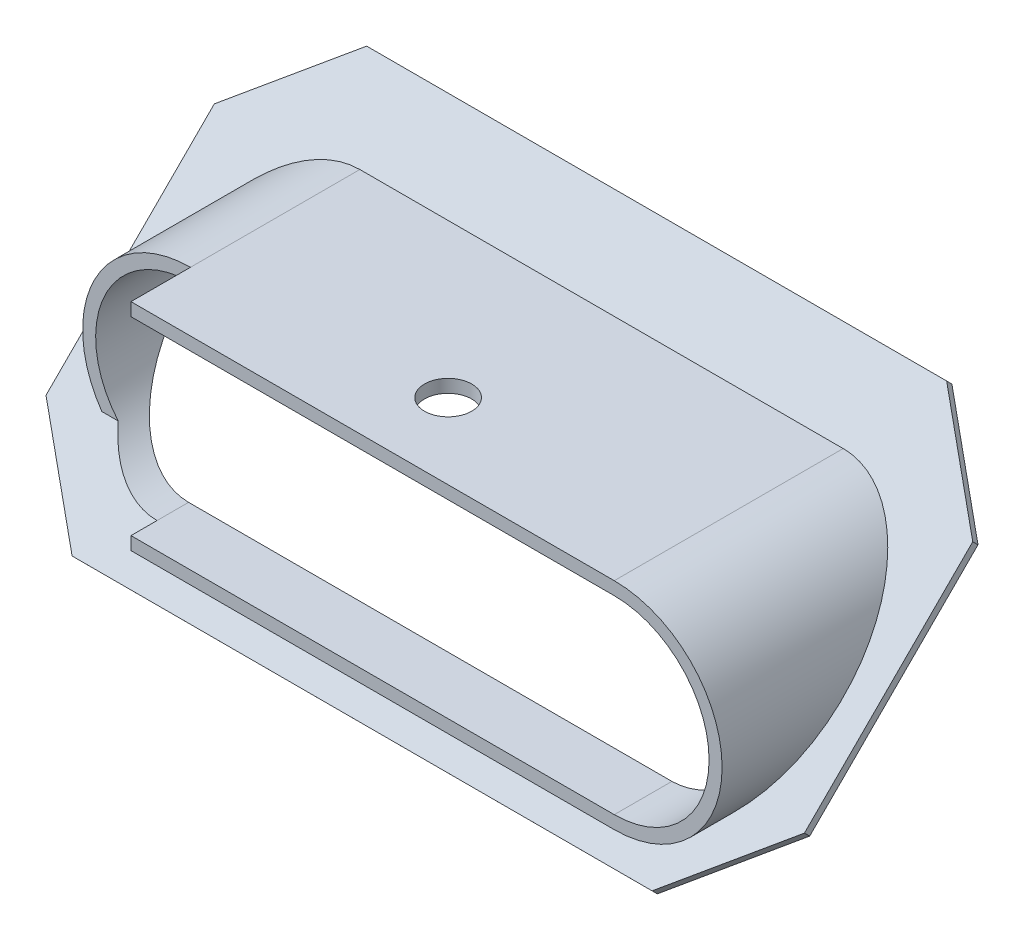
ISO-10303-21;
HEADER;
FILE_DESCRIPTION(('STEP AP214'),'2;1');
FILE_NAME('part.step','',(''),(''),'','','');
FILE_SCHEMA(('AUTOMOTIVE_DESIGN { 1 0 10303 214 1 1 1 1 }'));
ENDSEC;
DATA;
#1=APPLICATION_CONTEXT('core data for automotive mechanical design processes');
#2=APPLICATION_PROTOCOL_DEFINITION('international standard','automotive_design',2000,#1);
#3=PRODUCT_CONTEXT('',#1,'mechanical');
#4=PRODUCT('Part','Part','',(#3));
#5=PRODUCT_RELATED_PRODUCT_CATEGORY('part','',(#4));
#6=PRODUCT_DEFINITION_FORMATION('','',#4);
#7=PRODUCT_DEFINITION_CONTEXT('part definition',#1,'design');
#8=PRODUCT_DEFINITION('design','',#6,#7);
#9=PRODUCT_DEFINITION_SHAPE('','',#8);
#10=(LENGTH_UNIT() NAMED_UNIT(*) SI_UNIT(.MILLI.,.METRE.));
#11=(NAMED_UNIT(*) PLANE_ANGLE_UNIT() SI_UNIT($,.RADIAN.));
#12=(NAMED_UNIT(*) SI_UNIT($,.STERADIAN.) SOLID_ANGLE_UNIT());
#13=UNCERTAINTY_MEASURE_WITH_UNIT(LENGTH_MEASURE(1.E-05),#10,'distance_accuracy_value','');
#14=(GEOMETRIC_REPRESENTATION_CONTEXT(3) GLOBAL_UNCERTAINTY_ASSIGNED_CONTEXT((#13)) GLOBAL_UNIT_ASSIGNED_CONTEXT((#10,
#11,#12)) REPRESENTATION_CONTEXT('',''));
#15=CARTESIAN_POINT('',(0.,0.,0.));
#16=DIRECTION('',(0.,0.,1.));
#17=DIRECTION('',(1.,0.,0.));
#18=AXIS2_PLACEMENT_3D('',#15,#16,#17);
#19=CARTESIAN_POINT('',(69.7281455494334,21.9121249549721,35.0250079347562));
#20=DIRECTION('',(0.,0.,1.));
#21=DIRECTION('',(1.,0.,0.));
#22=AXIS2_PLACEMENT_3D('',#19,#20,#21);
#23=PLANE('',#22);
#24=DIRECTION('',(-1.,0.,0.));
#25=VECTOR('',#24,1.);
#26=CARTESIAN_POINT('',(0.,14.5,35.0250079347562));
#27=LINE('',#26,#25);
#28=CARTESIAN_POINT('',(32.5000000000001,14.5,35.0250079347562));
#29=VERTEX_POINT('',#28);
#30=CARTESIAN_POINT('',(-32.5000000000001,14.5,35.0250079347562));
#31=VERTEX_POINT('',#30);
#32=EDGE_CURVE('E211',#29,#31,#27,.T.);
#33=ORIENTED_EDGE('',*,*,#32,.T.);
#34=DIRECTION('',(0.,-1.,0.));
#35=VECTOR('',#34,1.);
#36=CARTESIAN_POINT('',(-32.5000000000001,21.9121249549721,35.0250079347562));
#37=LINE('',#36,#35);
#38=CARTESIAN_POINT('',(-32.5000000000001,12.75,35.0250079347562));
#39=VERTEX_POINT('',#38);
#40=EDGE_CURVE('E195',#31,#39,#37,.T.);
#41=ORIENTED_EDGE('',*,*,#40,.T.);
#42=DIRECTION('',(-1.,0.,0.));
#43=VECTOR('',#42,1.);
#44=CARTESIAN_POINT('',(-32.5000000000001,12.75,35.0250079347562));
#45=LINE('',#44,#43);
#46=CARTESIAN_POINT('',(32.5000000000001,12.75,35.0250079347562));
#47=VERTEX_POINT('',#46);
#48=EDGE_CURVE('E416',#47,#39,#45,.T.);
#49=ORIENTED_EDGE('',*,*,#48,.F.);
#50=CARTESIAN_POINT('',(32.5000000000001,0.,35.0250079347562));
#51=DIRECTION('',(0.,0.,1.));
#52=DIRECTION('',(1.,0.,0.));
#53=AXIS2_PLACEMENT_3D('',#50,#51,#52);
#54=CIRCLE('',#53,12.75);
#55=CARTESIAN_POINT('',(32.5000000000001,-12.75,35.0250079347562));
#56=VERTEX_POINT('',#55);
#57=EDGE_CURVE('E413',#47,#56,#54,.F.);
#58=ORIENTED_EDGE('',*,*,#57,.T.);
#59=DIRECTION('',(-1.,0.,0.));
#60=VECTOR('',#59,1.);
#61=CARTESIAN_POINT('',(-32.5000000000001,-12.75,35.0250079347562));
#62=LINE('',#61,#60);
#63=CARTESIAN_POINT('',(-32.5000000000001,-12.75,35.0250079347562));
#64=VERTEX_POINT('',#63);
#65=EDGE_CURVE('E208',#56,#64,#62,.T.);
#66=ORIENTED_EDGE('',*,*,#65,.T.);
#67=DIRECTION('',(0.,1.,0.));
#68=VECTOR('',#67,1.);
#69=CARTESIAN_POINT('',(-32.5000000000001,-14.5,35.0250079347562));
#70=LINE('',#69,#68);
#71=CARTESIAN_POINT('',(-32.5000000000001,-14.5,35.0250079347562));
#72=VERTEX_POINT('',#71);
#73=EDGE_CURVE('E378',#72,#64,#70,.T.);
#74=ORIENTED_EDGE('',*,*,#73,.F.);
#75=DIRECTION('',(-1.,0.,0.));
#76=VECTOR('',#75,1.);
#77=CARTESIAN_POINT('',(69.7281455494334,-14.5,35.0250079347562));
#78=LINE('',#77,#76);
#79=CARTESIAN_POINT('',(32.5000000000001,-14.5,35.0250079347562));
#80=VERTEX_POINT('',#79);
#81=EDGE_CURVE('E409',#80,#72,#78,.T.);
#82=ORIENTED_EDGE('',*,*,#81,.F.);
#83=CARTESIAN_POINT('',(32.5000000000001,0.,35.0250079347562));
#84=DIRECTION('',(0.,0.,1.));
#85=DIRECTION('',(1.,0.,0.));
#86=AXIS2_PLACEMENT_3D('',#83,#84,#85);
#87=CIRCLE('',#86,14.5);
#88=EDGE_CURVE('E213',#80,#29,#87,.T.);
#89=ORIENTED_EDGE('',*,*,#88,.T.);
#90=EDGE_LOOP('',(#33,#41,#49,#58,#66,#74,#82,#89));
#91=FACE_BOUND('',#90,.T.);
#92=ADVANCED_FACE('F41',(#91),#23,.T.);
#93=CARTESIAN_POINT('',(0.,14.5,80.0000000000001));
#94=DIRECTION('',(0.,-1.,0.));
#95=DIRECTION('',(0.,0.,-1.));
#96=AXIS2_PLACEMENT_3D('',#93,#94,#95);
#97=PLANE('',#96);
#98=CARTESIAN_POINT('',(2.62925291935353E-05,14.5,24.8750079347541));
#99=DIRECTION('',(0.,1.,0.));
#100=DIRECTION('',(0.,0.,1.));
#101=AXIS2_PLACEMENT_3D('',#98,#99,#100);
#102=CIRCLE('',#101,3.17499999999999);
#103=CARTESIAN_POINT('',(2.62925291935353E-05,14.5,28.0500079347541));
#104=VERTEX_POINT('',#103);
#105=EDGE_CURVE('E365',#104,#104,#102,.T.);
#106=ORIENTED_EDGE('',*,*,#105,.F.);
#107=EDGE_LOOP('',(#106));
#108=FACE_BOUND('',#107,.T.);
#109=ORIENTED_EDGE('',*,*,#32,.F.);
#110=DIRECTION('',(0.,0.,-1.));
#111=VECTOR('',#110,1.);
#112=CARTESIAN_POINT('',(32.5000000000001,14.5,80.0000000000001));
#113=LINE('',#112,#111);
#114=CARTESIAN_POINT('',(32.5000000000001,14.5,4.24460595078653));
#115=VERTEX_POINT('',#114);
#116=EDGE_CURVE('E463',#29,#115,#113,.T.);
#117=ORIENTED_EDGE('',*,*,#116,.T.);
#118=DIRECTION('',(-1.,0.,0.));
#119=VECTOR('',#118,1.);
#120=CARTESIAN_POINT('',(0.,14.5,4.24460595078653));
#121=LINE('',#120,#119);
#122=CARTESIAN_POINT('',(-32.5000000000001,14.5,4.24460595078652));
#123=VERTEX_POINT('',#122);
#124=EDGE_CURVE('E460',#115,#123,#121,.T.);
#125=ORIENTED_EDGE('',*,*,#124,.T.);
#126=DIRECTION('',(0.,0.,-1.));
#127=VECTOR('',#126,1.);
#128=CARTESIAN_POINT('',(-32.5000000000001,14.5,80.0000000000001));
#129=LINE('',#128,#127);
#130=CARTESIAN_POINT('',(-32.5000000000001,14.5,27.0250079347562));
#131=VERTEX_POINT('',#130);
#132=EDGE_CURVE('E222',#131,#123,#129,.T.);
#133=ORIENTED_EDGE('',*,*,#132,.F.);
#134=EDGE_CURVE('E200',#31,#131,#129,.T.);
#135=ORIENTED_EDGE('',*,*,#134,.F.);
#136=EDGE_LOOP('',(#109,#117,#125,#133,#135));
#137=FACE_BOUND('',#136,.T.);
#138=ADVANCED_FACE('F220',(#108,#137),#97,.F.);
#139=CARTESIAN_POINT('',(-32.5000000000001,0.,80.0000000000001));
#140=DIRECTION('',(0.,0.,-1.));
#141=DIRECTION('',(-1.,0.,0.));
#142=AXIS2_PLACEMENT_3D('',#139,#140,#141);
#143=CYLINDRICAL_SURFACE('',#142,14.5);
#144=CARTESIAN_POINT('',(-32.5000000000001,0.,18.7580361379704));
#145=DIRECTION('',(0.,0.707434021964028,0.706779388895714));
#146=DIRECTION('',(0.,0.706779388895714,-0.707434021964028));
#147=AXIS2_PLACEMENT_3D('',#144,#145,#146);
#148=ELLIPSE('',#147,20.5155954288015,14.5);
#149=CARTESIAN_POINT('',(-44.4177851377498,-8.25932184930662,27.0250079347562));
#150=VERTEX_POINT('',#149);
#151=EDGE_CURVE('E456',#123,#150,#148,.T.);
#152=ORIENTED_EDGE('',*,*,#151,.T.);
#153=CARTESIAN_POINT('',(-32.5000000000001,0.,27.0250079347562));
#154=DIRECTION('',(0.,0.,-1.));
#155=DIRECTION('',(-1.,0.,0.));
#156=AXIS2_PLACEMENT_3D('',#153,#154,#155);
#157=CIRCLE('',#156,14.5);
#158=EDGE_CURVE('E402',#150,#131,#157,.T.);
#159=ORIENTED_EDGE('',*,*,#158,.T.);
#160=ORIENTED_EDGE('',*,*,#132,.T.);
#161=EDGE_LOOP('',(#152,#159,#160));
#162=FACE_BOUND('',#161,.T.);
#163=ADVANCED_FACE('F494',(#162),#143,.T.);
#164=CARTESIAN_POINT('',(0.,-14.5,80.0000000000001));
#165=DIRECTION('',(0.,-1.,0.));
#166=DIRECTION('',(0.,0.,-1.));
#167=AXIS2_PLACEMENT_3D('',#164,#165,#166);
#168=PLANE('',#167);
#169=DIRECTION('',(0.,0.,-1.));
#170=VECTOR('',#169,1.);
#171=CARTESIAN_POINT('',(32.5000000000001,-14.5,80.0000000000001));
#172=LINE('',#171,#170);
#173=CARTESIAN_POINT('',(32.5000000000001,-14.5,33.2714663251543));
#174=VERTEX_POINT('',#173);
#175=EDGE_CURVE('E465',#80,#174,#172,.T.);
#176=ORIENTED_EDGE('',*,*,#175,.F.);
#177=ORIENTED_EDGE('',*,*,#81,.T.);
#178=DIRECTION('',(0.,0.,-1.));
#179=VECTOR('',#178,1.);
#180=CARTESIAN_POINT('',(-32.5000000000001,-14.5,80.0000000000001));
#181=LINE('',#180,#179);
#182=CARTESIAN_POINT('',(-32.5000000000001,-14.5,33.2714663251542));
#183=VERTEX_POINT('',#182);
#184=EDGE_CURVE('E231',#72,#183,#181,.T.);
#185=ORIENTED_EDGE('',*,*,#184,.T.);
#186=DIRECTION('',(-1.,0.,0.));
#187=VECTOR('',#186,1.);
#188=CARTESIAN_POINT('',(0.,-14.5,33.2714663251543));
#189=LINE('',#188,#187);
#190=EDGE_CURVE('E452',#174,#183,#189,.T.);
#191=ORIENTED_EDGE('',*,*,#190,.F.);
#192=EDGE_LOOP('',(#176,#177,#185,#191));
#193=FACE_BOUND('',#192,.T.);
#194=ADVANCED_FACE('F474',(#193),#168,.T.);
#195=CARTESIAN_POINT('',(32.5000000000001,0.,80.0000000000001));
#196=DIRECTION('',(0.,0.,-1.));
#197=DIRECTION('',(-1.,0.,0.));
#198=AXIS2_PLACEMENT_3D('',#195,#196,#197);
#199=CYLINDRICAL_SURFACE('',#198,14.5);
#200=ORIENTED_EDGE('',*,*,#88,.F.);
#201=ORIENTED_EDGE('',*,*,#175,.T.);
#202=CARTESIAN_POINT('',(32.5000000000001,0.,18.7580361379704));
#203=DIRECTION('',(0.,0.707434021964028,0.706779388895714));
#204=DIRECTION('',(0.,0.706779388895714,-0.707434021964028));
#205=AXIS2_PLACEMENT_3D('',#202,#203,#204);
#206=ELLIPSE('',#205,20.5155954288015,14.5);
#207=EDGE_CURVE('E224',#174,#115,#206,.T.);
#208=ORIENTED_EDGE('',*,*,#207,.T.);
#209=ORIENTED_EDGE('',*,*,#116,.F.);
#210=EDGE_LOOP('',(#200,#201,#208,#209));
#211=FACE_BOUND('',#210,.T.);
#212=ADVANCED_FACE('F483',(#211),#199,.T.);
#213=CARTESIAN_POINT('',(-32.5000000000001,0.,-5.29472242780894));
#214=DIRECTION('',(0.,0.,1.));
#215=DIRECTION('',(1.,0.,0.));
#216=AXIS2_PLACEMENT_3D('',#213,#214,#215);
#217=CYLINDRICAL_SURFACE('',#216,12.75);
#218=CARTESIAN_POINT('',(-32.5000000000001,0.,27.0250079347562));
#219=DIRECTION('',(0.,0.,-1.));
#220=DIRECTION('',(-1.,0.,0.));
#221=AXIS2_PLACEMENT_3D('',#218,#219,#220);
#222=CIRCLE('',#221,12.75);
#223=CARTESIAN_POINT('',(-32.5000000000001,12.75,27.0250079347562));
#224=VERTEX_POINT('',#223);
#225=CARTESIAN_POINT('',(-42.2131921935875,-8.25932184930662,27.0250079347562));
#226=VERTEX_POINT('',#225);
#227=EDGE_CURVE('E398',#224,#226,#222,.F.);
#228=ORIENTED_EDGE('',*,*,#227,.T.);
#229=CARTESIAN_POINT('',(-32.5000000000001,0.,18.7580361379704));
#230=DIRECTION('',(0.,-0.707434021964029,-0.706779388895714));
#231=DIRECTION('',(0.,-0.706779388895714,0.707434021964029));
#232=AXIS2_PLACEMENT_3D('',#229,#230,#231);
#233=ELLIPSE('',#232,18.0395752908427,12.75);
#234=CARTESIAN_POINT('',(-32.5000000000001,-12.75,31.5198454404941));
#235=VERTEX_POINT('',#234);
#236=EDGE_CURVE('E405',#226,#235,#233,.F.);
#237=ORIENTED_EDGE('',*,*,#236,.T.);
#238=DIRECTION('',(0.,0.,1.));
#239=VECTOR('',#238,1.);
#240=CARTESIAN_POINT('',(-32.5000000000001,-12.75,-5.29472242780894));
#241=LINE('',#240,#239);
#242=CARTESIAN_POINT('',(-32.5000000000001,-12.75,27.2752394897076));
#243=VERTEX_POINT('',#242);
#244=EDGE_CURVE('E217',#243,#235,#241,.T.);
#245=ORIENTED_EDGE('',*,*,#244,.F.);
#246=CARTESIAN_POINT('',(-32.5000000000001,0.,14.5134301871838));
#247=DIRECTION('',(0.,0.707434021964029,0.706779388895714));
#248=DIRECTION('',(0.,-0.706779388895714,0.707434021964029));
#249=AXIS2_PLACEMENT_3D('',#246,#247,#248);
#250=ELLIPSE('',#249,18.0395752908427,12.75);
#251=CARTESIAN_POINT('',(-32.5000000000001,12.75,1.75162088466012));
#252=VERTEX_POINT('',#251);
#253=EDGE_CURVE('E245',#252,#243,#250,.T.);
#254=ORIENTED_EDGE('',*,*,#253,.F.);
#255=DIRECTION('',(0.,0.,1.));
#256=VECTOR('',#255,1.);
#257=CARTESIAN_POINT('',(-32.5000000000001,12.75,-5.29472242780894));
#258=LINE('',#257,#256);
#259=EDGE_CURVE('E421',#252,#224,#258,.T.);
#260=ORIENTED_EDGE('',*,*,#259,.T.);
#261=EDGE_LOOP('',(#228,#237,#245,#254,#260));
#262=FACE_BOUND('',#261,.T.);
#263=ADVANCED_FACE('F485',(#262),#217,.F.);
#264=CARTESIAN_POINT('',(-32.5000000000001,12.75,-5.29472242780894));
#265=DIRECTION('',(0.,-1.,0.));
#266=DIRECTION('',(1.,0.,0.));
#267=AXIS2_PLACEMENT_3D('',#264,#265,#266);
#268=PLANE('',#267);
#269=CARTESIAN_POINT('',(2.62925291935353E-05,12.75,24.8750079347541));
#270=DIRECTION('',(0.,-1.,0.));
#271=DIRECTION('',(1.,0.,0.));
#272=AXIS2_PLACEMENT_3D('',#269,#270,#271);
#273=CIRCLE('',#272,3.17499999999999);
#274=CARTESIAN_POINT('',(3.17502629252919,12.75,24.8750079347541));
#275=VERTEX_POINT('',#274);
#276=EDGE_CURVE('E372',#275,#275,#273,.T.);
#277=ORIENTED_EDGE('',*,*,#276,.F.);
#278=EDGE_LOOP('',(#277));
#279=FACE_BOUND('',#278,.T.);
#280=DIRECTION('',(0.,0.,1.));
#281=VECTOR('',#280,1.);
#282=CARTESIAN_POINT('',(32.5000000000001,12.75,-5.29472242780894));
#283=LINE('',#282,#281);
#284=CARTESIAN_POINT('',(32.5000000000001,12.75,1.75162088466014));
#285=VERTEX_POINT('',#284);
#286=EDGE_CURVE('E426',#285,#47,#283,.T.);
#287=ORIENTED_EDGE('',*,*,#286,.T.);
#288=ORIENTED_EDGE('',*,*,#48,.T.);
#289=DIRECTION('',(0.,0.,-1.));
#290=VECTOR('',#289,1.);
#291=CARTESIAN_POINT('',(-32.5000000000001,12.75,-5.29472242780894));
#292=LINE('',#291,#290);
#293=EDGE_CURVE('E203',#39,#224,#292,.T.);
#294=ORIENTED_EDGE('',*,*,#293,.T.);
#295=ORIENTED_EDGE('',*,*,#259,.F.);
#296=DIRECTION('',(1.,0.,0.));
#297=VECTOR('',#296,1.);
#298=CARTESIAN_POINT('',(-47.0000000000001,12.75,1.75162088466011));
#299=LINE('',#298,#297);
#300=EDGE_CURVE('E242',#252,#285,#299,.T.);
#301=ORIENTED_EDGE('',*,*,#300,.T.);
#302=EDGE_LOOP('',(#287,#288,#294,#295,#301));
#303=FACE_BOUND('',#302,.T.);
#304=ADVANCED_FACE('F491',(#279,#303),#268,.T.);
#305=CARTESIAN_POINT('',(32.5000000000001,0.,-5.29472242780894));
#306=DIRECTION('',(0.,0.,1.));
#307=DIRECTION('',(1.,0.,0.));
#308=AXIS2_PLACEMENT_3D('',#305,#306,#307);
#309=CYLINDRICAL_SURFACE('',#308,12.75);
#310=ORIENTED_EDGE('',*,*,#57,.F.);
#311=ORIENTED_EDGE('',*,*,#286,.F.);
#312=CARTESIAN_POINT('',(32.5000000000001,0.,14.5134301871839));
#313=DIRECTION('',(0.,0.707434021964029,0.706779388895714));
#314=DIRECTION('',(0.,-0.706779388895714,0.707434021964029));
#315=AXIS2_PLACEMENT_3D('',#312,#313,#314);
#316=ELLIPSE('',#315,18.0395752908427,12.75);
#317=CARTESIAN_POINT('',(32.5000000000001,-12.75,27.2752394897076));
#318=VERTEX_POINT('',#317);
#319=EDGE_CURVE('E238',#318,#285,#316,.T.);
#320=ORIENTED_EDGE('',*,*,#319,.F.);
#321=DIRECTION('',(0.,0.,1.));
#322=VECTOR('',#321,1.);
#323=CARTESIAN_POINT('',(32.5000000000001,-12.75,-5.29472242780894));
#324=LINE('',#323,#322);
#325=EDGE_CURVE('E430',#318,#56,#324,.T.);
#326=ORIENTED_EDGE('',*,*,#325,.T.);
#327=EDGE_LOOP('',(#310,#311,#320,#326));
#328=FACE_BOUND('',#327,.T.);
#329=ADVANCED_FACE('F510',(#328),#309,.F.);
#330=CARTESIAN_POINT('',(-32.5000000000001,-12.75,-5.29472242780894));
#331=DIRECTION('',(0.,-1.,0.));
#332=DIRECTION('',(1.,0.,0.));
#333=AXIS2_PLACEMENT_3D('',#330,#331,#332);
#334=PLANE('',#333);
#335=ORIENTED_EDGE('',*,*,#65,.F.);
#336=ORIENTED_EDGE('',*,*,#325,.F.);
#337=DIRECTION('',(1.,0.,0.));
#338=VECTOR('',#337,1.);
#339=CARTESIAN_POINT('',(-47.0000000000001,-12.75,27.2752394897076));
#340=LINE('',#339,#338);
#341=EDGE_CURVE('E229',#243,#318,#340,.T.);
#342=ORIENTED_EDGE('',*,*,#341,.F.);
#343=ORIENTED_EDGE('',*,*,#244,.T.);
#344=DIRECTION('',(0.,0.,-1.));
#345=VECTOR('',#344,1.);
#346=CARTESIAN_POINT('',(-32.5000000000001,-12.75,-5.29472242780894));
#347=LINE('',#346,#345);
#348=EDGE_CURVE('E393',#64,#235,#347,.T.);
#349=ORIENTED_EDGE('',*,*,#348,.F.);
#350=EDGE_LOOP('',(#335,#336,#342,#343,#349));
#351=FACE_BOUND('',#350,.T.);
#352=ADVANCED_FACE('F514',(#351),#334,.F.);
#353=CARTESIAN_POINT('',(51.,21.9121249549721,-3.17438426112178));
#354=DIRECTION('',(1.,0.,0.));
#355=DIRECTION('',(0.,0.,-1.));
#356=AXIS2_PLACEMENT_3D('',#353,#354,#355);
#357=PLANE('',#356);
#358=DIRECTION('',(0.,-0.707434021964028,-0.706779388895714));
#359=VECTOR('',#358,1.);
#360=CARTESIAN_POINT('',(51.,-9.18616815643932,27.9527127052955));
#361=LINE('',#360,#359);
#362=CARTESIAN_POINT('',(51.,-9.18616815643931,27.9527127052955));
#363=VERTEX_POINT('',#362);
#364=CARTESIAN_POINT('',(51.,-9.89360217840334,27.2459333163998));
#365=VERTEX_POINT('',#364);
#366=EDGE_CURVE('E276',#363,#365,#361,.T.);
#367=ORIENTED_EDGE('',*,*,#366,.T.);
#368=DIRECTION('',(0.,0.706779388895714,-0.707434021964029));
#369=VECTOR('',#368,1.);
#370=CARTESIAN_POINT('',(51.,12.7233382662595,4.60804461355087));
#371=LINE('',#370,#369);
#372=CARTESIAN_POINT('',(51.,12.7233382662595,4.60804461355086));
#373=VERTEX_POINT('',#372);
#374=EDGE_CURVE('E319',#365,#373,#371,.T.);
#375=ORIENTED_EDGE('',*,*,#374,.T.);
#376=DIRECTION('',(0.,0.707434021964028,0.706779388895714));
#377=VECTOR('',#376,1.);
#378=CARTESIAN_POINT('',(51.,13.4307722882235,5.31482400244658));
#379=LINE('',#378,#377);
#380=CARTESIAN_POINT('',(51.,13.4307722882235,5.31482400244658));
#381=VERTEX_POINT('',#380);
#382=EDGE_CURVE('E280',#373,#381,#379,.T.);
#383=ORIENTED_EDGE('',*,*,#382,.T.);
#384=DIRECTION('',(0.,-0.706779388895714,0.707434021964028));
#385=VECTOR('',#384,1.);
#386=CARTESIAN_POINT('',(51.,21.9121249549721,-3.17438426112178));
#387=LINE('',#386,#385);
#388=EDGE_CURVE('E425',#381,#363,#387,.T.);
#389=ORIENTED_EDGE('',*,*,#388,.T.);
#390=EDGE_LOOP('',(#367,#375,#383,#389));
#391=FACE_BOUND('',#390,.T.);
#392=ADVANCED_FACE('F517',(#391),#357,.T.);
#393=CARTESIAN_POINT('',(-51.,21.9121249549721,-3.1743842611218));
#394=DIRECTION('',(0.,0.706779388895714,-0.707434021964028));
#395=DIRECTION('',(0.,0.707434021964028,0.706779388895714));
#396=AXIS2_PLACEMENT_3D('',#393,#394,#395);
#397=PLANE('',#396);
#398=DIRECTION('',(0.,-0.707434021964028,-0.706779388895714));
#399=VECTOR('',#398,1.);
#400=CARTESIAN_POINT('',(39.,21.9121249549721,-3.17438426112178));
#401=LINE('',#400,#399);
#402=CARTESIAN_POINT('',(39.,21.9121249549721,-3.17438426112178));
#403=VERTEX_POINT('',#402);
#404=CARTESIAN_POINT('',(39.,21.2046909330081,-3.88116365001749));
#405=VERTEX_POINT('',#404);
#406=EDGE_CURVE('E257',#403,#405,#401,.T.);
#407=ORIENTED_EDGE('',*,*,#406,.T.);
#408=DIRECTION('',(-1.,0.,0.));
#409=VECTOR('',#408,1.);
#410=CARTESIAN_POINT('',(-39.,21.2046909330081,-3.88116365001751));
#411=LINE('',#410,#409);
#412=CARTESIAN_POINT('',(-39.,21.2046909330081,-3.88116365001751));
#413=VERTEX_POINT('',#412);
#414=EDGE_CURVE('E325',#405,#413,#411,.T.);
#415=ORIENTED_EDGE('',*,*,#414,.T.);
#416=DIRECTION('',(0.,0.707434021964028,0.706779388895714));
#417=VECTOR('',#416,1.);
#418=CARTESIAN_POINT('',(-39.,21.9121249549721,-3.1743842611218));
#419=LINE('',#418,#417);
#420=CARTESIAN_POINT('',(-39.,21.9121249549721,-3.1743842611218));
#421=VERTEX_POINT('',#420);
#422=EDGE_CURVE('E261',#413,#421,#419,.T.);
#423=ORIENTED_EDGE('',*,*,#422,.T.);
#424=DIRECTION('',(1.,0.,0.));
#425=VECTOR('',#424,1.);
#426=CARTESIAN_POINT('',(-51.,21.9121249549721,-3.1743842611218));
#427=LINE('',#426,#425);
#428=EDGE_CURVE('E448',#421,#403,#427,.T.);
#429=ORIENTED_EDGE('',*,*,#428,.T.);
#430=EDGE_LOOP('',(#407,#415,#423,#429));
#431=FACE_BOUND('',#430,.T.);
#432=ADVANCED_FACE('F524',(#431),#397,.T.);
#433=CARTESIAN_POINT('',(-51.,21.9121249549721,-3.1743842611218));
#434=DIRECTION('',(-1.,0.,0.));
#435=DIRECTION('',(0.,-1.,0.));
#436=AXIS2_PLACEMENT_3D('',#433,#434,#435);
#437=PLANE('',#436);
#438=DIRECTION('',(0.,-0.707434021964028,-0.706779388895714));
#439=VECTOR('',#438,1.);
#440=CARTESIAN_POINT('',(-51.,13.4307722882235,5.31482400244653));
#441=LINE('',#440,#439);
#442=CARTESIAN_POINT('',(-51.,13.4307722882235,5.31482400244653));
#443=VERTEX_POINT('',#442);
#444=CARTESIAN_POINT('',(-51.,12.7233382662595,4.60804461355082));
#445=VERTEX_POINT('',#444);
#446=EDGE_CURVE('E254',#443,#445,#441,.T.);
#447=ORIENTED_EDGE('',*,*,#446,.T.);
#448=DIRECTION('',(0.,-0.706779388895714,0.707434021964029));
#449=VECTOR('',#448,1.);
#450=CARTESIAN_POINT('',(-51.,-9.89360217840331,27.2459333163997));
#451=LINE('',#450,#449);
#452=CARTESIAN_POINT('',(-51.,-9.89360217840331,27.2459333163997));
#453=VERTEX_POINT('',#452);
#454=EDGE_CURVE('E51',#445,#453,#451,.T.);
#455=ORIENTED_EDGE('',*,*,#454,.T.);
#456=DIRECTION('',(0.,0.707434021964028,0.706779388895714));
#457=VECTOR('',#456,1.);
#458=CARTESIAN_POINT('',(-51.,-9.18616815643929,27.9527127052954));
#459=LINE('',#458,#457);
#460=CARTESIAN_POINT('',(-51.,-9.18616815643929,27.9527127052954));
#461=VERTEX_POINT('',#460);
#462=EDGE_CURVE('E207',#453,#461,#459,.T.);
#463=ORIENTED_EDGE('',*,*,#462,.T.);
#464=DIRECTION('',(0.,0.706779388895714,-0.707434021964028));
#465=VECTOR('',#464,1.);
#466=CARTESIAN_POINT('',(-51.,21.9121249549721,-3.1743842611218));
#467=LINE('',#466,#465);
#468=EDGE_CURVE('E444',#461,#443,#467,.T.);
#469=ORIENTED_EDGE('',*,*,#468,.T.);
#470=EDGE_LOOP('',(#447,#455,#463,#469));
#471=FACE_BOUND('',#470,.T.);
#472=ADVANCED_FACE('F527',(#471),#437,.T.);
#473=CARTESIAN_POINT('',(-51.,-17.6675208231879,36.4419209688638));
#474=DIRECTION('',(0.,-0.706779388895714,0.707434021964028));
#475=DIRECTION('',(0.,-0.707434021964028,-0.706779388895714));
#476=AXIS2_PLACEMENT_3D('',#473,#474,#475);
#477=PLANE('',#476);
#478=DIRECTION('',(0.,-0.707434021964028,-0.706779388895714));
#479=VECTOR('',#478,1.);
#480=CARTESIAN_POINT('',(-39.,-17.6675208231879,36.4419209688638));
#481=LINE('',#480,#479);
#482=CARTESIAN_POINT('',(-39.,-17.6675208231879,36.4419209688638));
#483=VERTEX_POINT('',#482);
#484=CARTESIAN_POINT('',(-39.,-18.3749548451519,35.7351415799681));
#485=VERTEX_POINT('',#484);
#486=EDGE_CURVE('E283',#483,#485,#481,.T.);
#487=ORIENTED_EDGE('',*,*,#486,.T.);
#488=DIRECTION('',(1.,0.,0.));
#489=VECTOR('',#488,1.);
#490=CARTESIAN_POINT('',(38.9999999999999,-18.3749548451519,35.7351415799681));
#491=LINE('',#490,#489);
#492=CARTESIAN_POINT('',(38.9999999999999,-18.3749548451519,35.7351415799681));
#493=VERTEX_POINT('',#492);
#494=EDGE_CURVE('E328',#485,#493,#491,.T.);
#495=ORIENTED_EDGE('',*,*,#494,.T.);
#496=DIRECTION('',(0.,0.707434021964028,0.706779388895714));
#497=VECTOR('',#496,1.);
#498=CARTESIAN_POINT('',(38.9999999999999,-17.6675208231879,36.4419209688638));
#499=LINE('',#498,#497);
#500=CARTESIAN_POINT('',(38.9999999999999,-17.6675208231879,36.4419209688638));
#501=VERTEX_POINT('',#500);
#502=EDGE_CURVE('E287',#493,#501,#499,.T.);
#503=ORIENTED_EDGE('',*,*,#502,.T.);
#504=DIRECTION('',(-1.,0.,0.));
#505=VECTOR('',#504,1.);
#506=CARTESIAN_POINT('',(-51.,-17.6675208231879,36.4419209688638));
#507=LINE('',#506,#505);
#508=EDGE_CURVE('E440',#501,#483,#507,.T.);
#509=ORIENTED_EDGE('',*,*,#508,.T.);
#510=EDGE_LOOP('',(#487,#495,#503,#509));
#511=FACE_BOUND('',#510,.T.);
#512=ADVANCED_FACE('F523',(#511),#477,.T.);
#513=CARTESIAN_POINT('',(0.,9.37901404965901,9.37033505973985));
#514=DIRECTION('',(0.,0.707434021964028,0.706779388895714));
#515=DIRECTION('',(0.,-0.706779388895714,0.707434021964028));
#516=AXIS2_PLACEMENT_3D('',#513,#514,#515);
#517=PLANE('',#516);
#518=ORIENTED_EDGE('',*,*,#190,.T.);
#519=DIRECTION('',(0.,-0.706779388895714,0.707434021964028));
#520=VECTOR('',#519,1.);
#521=CARTESIAN_POINT('',(-32.5000000000001,-8.25932184930661,27.0250079347562));
#522=LINE('',#521,#520);
#523=EDGE_CURVE('E386',#235,#183,#522,.T.);
#524=ORIENTED_EDGE('',*,*,#523,.F.);
#525=ORIENTED_EDGE('',*,*,#236,.F.);
#526=DIRECTION('',(-1.,0.,0.));
#527=VECTOR('',#526,1.);
#528=CARTESIAN_POINT('',(-32.5000000000001,-8.25932184930661,27.0250079347562));
#529=LINE('',#528,#527);
#530=EDGE_CURVE('E389',#226,#150,#529,.T.);
#531=ORIENTED_EDGE('',*,*,#530,.T.);
#532=ORIENTED_EDGE('',*,*,#151,.F.);
#533=ORIENTED_EDGE('',*,*,#124,.F.);
#534=ORIENTED_EDGE('',*,*,#207,.F.);
#535=EDGE_LOOP('',(#518,#524,#525,#531,#532,#533,#534));
#536=FACE_BOUND('',#535,.T.);
#537=ORIENTED_EDGE('',*,*,#428,.F.);
#538=DIRECTION('',(0.707106781186549,0.499768498691042,-0.500231394172836));
#539=VECTOR('',#538,1.);
#540=CARTESIAN_POINT('',(-28.3663528550931,29.427767585782,-10.6969880289895));
#541=LINE('',#540,#539);
#542=EDGE_CURVE('E273',#421,#443,#541,.F.);
#543=ORIENTED_EDGE('',*,*,#542,.T.);
#544=ORIENTED_EDGE('',*,*,#468,.F.);
#545=DIRECTION('',(-0.707106781186546,0.499768498691044,-0.500231394172839));
#546=VECTOR('',#545,1.);
#547=CARTESIAN_POINT('',(-38.6336471449069,-17.9264514702308,36.7010914426003));
#548=LINE('',#547,#546);
#549=EDGE_CURVE('E264',#461,#483,#548,.F.);
#550=ORIENTED_EDGE('',*,*,#549,.T.);
#551=ORIENTED_EDGE('',*,*,#508,.F.);
#552=DIRECTION('',(-0.707106781186549,-0.499768498691042,0.500231394172836));
#553=VECTOR('',#552,1.);
#554=CARTESIAN_POINT('',(38.6336471449067,-17.9264514702309,36.7010914426004));
#555=LINE('',#554,#553);
#556=EDGE_CURVE('E267',#501,#363,#555,.F.);
#557=ORIENTED_EDGE('',*,*,#556,.T.);
#558=ORIENTED_EDGE('',*,*,#388,.F.);
#559=DIRECTION('',(0.707106781186546,-0.499768498691044,0.500231394172839));
#560=VECTOR('',#559,1.);
#561=CARTESIAN_POINT('',(28.3663528550933,29.4277675857819,-10.6969880289895));
#562=LINE('',#561,#560);
#563=EDGE_CURVE('E270',#381,#403,#562,.F.);
#564=ORIENTED_EDGE('',*,*,#563,.T.);
#565=EDGE_LOOP('',(#537,#543,#544,#550,#551,#557,#558,#564));
#566=FACE_BOUND('',#565,.T.);
#567=ADVANCED_FACE('F479',(#536,#566),#517,.T.);
#568=CARTESIAN_POINT('',(-47.0000000000001,14.5,0.));
#569=DIRECTION('',(0.,0.707434021964029,0.706779388895714));
#570=DIRECTION('',(0.,-0.706779388895714,0.707434021964029));
#571=AXIS2_PLACEMENT_3D('',#568,#569,#570);
#572=PLANE('',#571);
#573=DIRECTION('',(0.,-0.706779388895714,0.707434021964029));
#574=VECTOR('',#573,1.);
#575=CARTESIAN_POINT('',(49.,-11.3084702223314,25.8323745386083));
#576=LINE('',#575,#574);
#577=CARTESIAN_POINT('',(49.,10.7229550053587,3.78054336852269));
#578=VERTEX_POINT('',#577);
#579=CARTESIAN_POINT('',(49.,-10.7229550053587,25.246317005845));
#580=VERTEX_POINT('',#579);
#581=EDGE_CURVE('E308',#578,#580,#576,.T.);
#582=ORIENTED_EDGE('',*,*,#581,.T.);
#583=DIRECTION('',(-0.707106781186549,-0.499768498691042,0.500231394172836));
#584=VECTOR('',#583,1.);
#585=CARTESIAN_POINT('',(37.5857864376268,-18.7902858916979,33.321120013831));
#586=LINE('',#585,#584);
#587=CARTESIAN_POINT('',(38.1715728752537,-18.3762641112886,32.9067147582486));
#588=VERTEX_POINT('',#587);
#589=EDGE_CURVE('E311',#580,#588,#586,.T.);
#590=ORIENTED_EDGE('',*,*,#589,.T.);
#591=DIRECTION('',(-1.,0.,0.));
#592=VECTOR('',#591,1.);
#593=CARTESIAN_POINT('',(-39.,-18.3762641112886,32.9067147582486));
#594=LINE('',#593,#592);
#595=CARTESIAN_POINT('',(-38.1715728752538,-18.3762641112886,32.9067147582486));
#596=VERTEX_POINT('',#595);
#597=EDGE_CURVE('E299',#588,#596,#594,.T.);
#598=ORIENTED_EDGE('',*,*,#597,.T.);
#599=DIRECTION('',(-0.707106781186546,0.499768498691044,-0.500231394172839));
#600=VECTOR('',#599,1.);
#601=CARTESIAN_POINT('',(-49.5857864376269,-10.3089332249493,24.8319117502626));
#602=LINE('',#601,#600);
#603=CARTESIAN_POINT('',(-49.,-10.7229550053586,25.246317005845));
#604=VERTEX_POINT('',#603);
#605=EDGE_CURVE('E296',#596,#604,#602,.T.);
#606=ORIENTED_EDGE('',*,*,#605,.T.);
#607=DIRECTION('',(0.,0.706779388895714,-0.707434021964029));
#608=VECTOR('',#607,1.);
#609=CARTESIAN_POINT('',(-49.,11.3084702223314,3.19448583575938));
#610=LINE('',#609,#608);
#611=CARTESIAN_POINT('',(-49.,10.7229550053587,3.78054336852267));
#612=VERTEX_POINT('',#611);
#613=EDGE_CURVE('E293',#604,#612,#610,.T.);
#614=ORIENTED_EDGE('',*,*,#613,.T.);
#615=DIRECTION('',(0.707106781186549,0.499768498691042,-0.500231394172836));
#616=VECTOR('',#615,1.);
#617=CARTESIAN_POINT('',(-37.5857864376269,18.7902858916979,-4.29425963946327));
#618=LINE('',#617,#616);
#619=CARTESIAN_POINT('',(-38.1715728752538,18.3762641112886,-3.87985438388089));
#620=VERTEX_POINT('',#619);
#621=EDGE_CURVE('E290',#612,#620,#618,.T.);
#622=ORIENTED_EDGE('',*,*,#621,.T.);
#623=DIRECTION('',(1.,0.,0.));
#624=VECTOR('',#623,1.);
#625=CARTESIAN_POINT('',(39.,18.3762641112886,-3.87985438388087));
#626=LINE('',#625,#624);
#627=CARTESIAN_POINT('',(38.1715728752539,18.3762641112886,-3.87985438388087));
#628=VERTEX_POINT('',#627);
#629=EDGE_CURVE('E302',#620,#628,#626,.T.);
#630=ORIENTED_EDGE('',*,*,#629,.T.);
#631=DIRECTION('',(0.707106781186546,-0.499768498691044,0.500231394172839));
#632=VECTOR('',#631,1.);
#633=CARTESIAN_POINT('',(49.5857864376269,10.3089332249493,4.19494862410509));
#634=LINE('',#633,#632);
#635=EDGE_CURVE('E305',#628,#578,#634,.T.);
#636=ORIENTED_EDGE('',*,*,#635,.T.);
#637=EDGE_LOOP('',(#582,#590,#598,#606,#614,#622,#630,#636));
#638=FACE_BOUND('',#637,.T.);
#639=ORIENTED_EDGE('',*,*,#300,.F.);
#640=ORIENTED_EDGE('',*,*,#253,.T.);
#641=ORIENTED_EDGE('',*,*,#341,.T.);
#642=ORIENTED_EDGE('',*,*,#319,.T.);
#643=EDGE_LOOP('',(#639,#640,#641,#642));
#644=FACE_BOUND('',#643,.T.);
#645=ADVANCED_FACE('F522',(#638,#644),#572,.F.);
#646=CARTESIAN_POINT('',(-32.5000000000001,14.5,27.0250079347562));
#647=DIRECTION('',(0.,0.,-1.));
#648=DIRECTION('',(-1.,0.,0.));
#649=AXIS2_PLACEMENT_3D('',#646,#647,#648);
#650=PLANE('',#649);
#651=ORIENTED_EDGE('',*,*,#530,.F.);
#652=ORIENTED_EDGE('',*,*,#227,.F.);
#653=DIRECTION('',(0.,-1.,0.));
#654=VECTOR('',#653,1.);
#655=CARTESIAN_POINT('',(-32.5000000000001,14.5,27.0250079347562));
#656=LINE('',#655,#654);
#657=EDGE_CURVE('E383',#131,#224,#656,.T.);
#658=ORIENTED_EDGE('',*,*,#657,.F.);
#659=ORIENTED_EDGE('',*,*,#158,.F.);
#660=EDGE_LOOP('',(#651,#652,#658,#659));
#661=FACE_BOUND('',#660,.T.);
#662=ADVANCED_FACE('F506',(#661),#650,.F.);
#663=CARTESIAN_POINT('',(-32.5000000000001,0.,0.));
#664=DIRECTION('',(-1.,0.,0.));
#665=DIRECTION('',(0.,-1.,0.));
#666=AXIS2_PLACEMENT_3D('',#663,#664,#665);
#667=PLANE('',#666);
#668=ORIENTED_EDGE('',*,*,#348,.T.);
#669=ORIENTED_EDGE('',*,*,#523,.T.);
#670=ORIENTED_EDGE('',*,*,#184,.F.);
#671=ORIENTED_EDGE('',*,*,#73,.T.);
#672=EDGE_LOOP('',(#668,#669,#670,#671));
#673=FACE_BOUND('',#672,.T.);
#674=ADVANCED_FACE('F541',(#673),#667,.T.);
#675=ORIENTED_EDGE('',*,*,#40,.F.);
#676=ORIENTED_EDGE('',*,*,#134,.T.);
#677=ORIENTED_EDGE('',*,*,#657,.T.);
#678=ORIENTED_EDGE('',*,*,#293,.F.);
#679=EDGE_LOOP('',(#675,#676,#677,#678));
#680=FACE_BOUND('',#679,.T.);
#681=ADVANCED_FACE('F197',(#680),#667,.T.);
#682=CARTESIAN_POINT('',(2.62925291935353E-05,14.5,24.8750079347541));
#683=DIRECTION('',(0.,1.,0.));
#684=DIRECTION('',(0.,0.,1.));
#685=AXIS2_PLACEMENT_3D('',#682,#683,#684);
#686=CYLINDRICAL_SURFACE('',#685,3.17499999999999);
#687=ORIENTED_EDGE('',*,*,#276,.T.);
#688=EDGE_LOOP('',(#687));
#689=FACE_BOUND('',#688,.T.);
#690=ORIENTED_EDGE('',*,*,#105,.T.);
#691=EDGE_LOOP('',(#690));
#692=FACE_BOUND('',#691,.T.);
#693=ADVANCED_FACE('F559',(#689,#692),#686,.F.);
#694=CARTESIAN_POINT('',(-51.,13.4307722882235,5.31482400244653));
#695=DIRECTION('',(0.707106781186546,-0.499768498691044,0.500231394172839));
#696=DIRECTION('',(0.,-0.707434021964028,-0.706779388895714));
#697=AXIS2_PLACEMENT_3D('',#694,#695,#696);
#698=PLANE('',#697);
#699=ORIENTED_EDGE('',*,*,#422,.F.);
#700=DIRECTION('',(0.707106781186549,0.499768498691042,-0.500231394172836));
#701=VECTOR('',#700,1.);
#702=CARTESIAN_POINT('',(-51.,12.7233382662595,4.60804461355082));
#703=LINE('',#702,#701);
#704=EDGE_CURVE('E11',#413,#445,#703,.F.);
#705=ORIENTED_EDGE('',*,*,#704,.T.);
#706=ORIENTED_EDGE('',*,*,#446,.F.);
#707=ORIENTED_EDGE('',*,*,#542,.F.);
#708=EDGE_LOOP('',(#699,#705,#706,#707));
#709=FACE_BOUND('',#708,.T.);
#710=ADVANCED_FACE('F562',(#709),#698,.F.);
#711=CARTESIAN_POINT('',(39.,21.9121249549721,-3.17438426112178));
#712=DIRECTION('',(-0.707106781186549,-0.499768498691042,0.500231394172836));
#713=DIRECTION('',(0.,-0.707434021964028,-0.706779388895714));
#714=AXIS2_PLACEMENT_3D('',#711,#712,#713);
#715=PLANE('',#714);
#716=ORIENTED_EDGE('',*,*,#382,.F.);
#717=DIRECTION('',(0.707106781186546,-0.499768498691044,0.500231394172839));
#718=VECTOR('',#717,1.);
#719=CARTESIAN_POINT('',(39.,21.204690933008,-3.88116365001751));
#720=LINE('',#719,#718);
#721=EDGE_CURVE('E322',#373,#405,#720,.F.);
#722=ORIENTED_EDGE('',*,*,#721,.T.);
#723=ORIENTED_EDGE('',*,*,#406,.F.);
#724=ORIENTED_EDGE('',*,*,#563,.F.);
#725=EDGE_LOOP('',(#716,#722,#723,#724));
#726=FACE_BOUND('',#725,.T.);
#727=ADVANCED_FACE('F567',(#726),#715,.F.);
#728=CARTESIAN_POINT('',(51.,-9.18616815643932,27.9527127052955));
#729=DIRECTION('',(-0.707106781186546,0.499768498691044,-0.500231394172839));
#730=DIRECTION('',(0.,-0.707434021964028,-0.706779388895714));
#731=AXIS2_PLACEMENT_3D('',#728,#729,#730);
#732=PLANE('',#731);
#733=ORIENTED_EDGE('',*,*,#502,.F.);
#734=DIRECTION('',(-0.707106781186549,-0.499768498691042,0.500231394172836));
#735=VECTOR('',#734,1.);
#736=CARTESIAN_POINT('',(51.,-9.89360217840333,27.2459333163998));
#737=LINE('',#736,#735);
#738=EDGE_CURVE('E315',#493,#365,#737,.F.);
#739=ORIENTED_EDGE('',*,*,#738,.T.);
#740=ORIENTED_EDGE('',*,*,#366,.F.);
#741=ORIENTED_EDGE('',*,*,#556,.F.);
#742=EDGE_LOOP('',(#733,#739,#740,#741));
#743=FACE_BOUND('',#742,.T.);
#744=ADVANCED_FACE('F573',(#743),#732,.F.);
#745=CARTESIAN_POINT('',(-39.,-17.6675208231879,36.4419209688638));
#746=DIRECTION('',(0.707106781186549,0.499768498691042,-0.500231394172836));
#747=DIRECTION('',(0.,-0.707434021964028,-0.706779388895714));
#748=AXIS2_PLACEMENT_3D('',#745,#746,#747);
#749=PLANE('',#748);
#750=ORIENTED_EDGE('',*,*,#462,.F.);
#751=DIRECTION('',(-0.707106781186546,0.499768498691044,-0.500231394172839));
#752=VECTOR('',#751,1.);
#753=CARTESIAN_POINT('',(-39.,-18.3749548451519,35.7351415799681));
#754=LINE('',#753,#752);
#755=EDGE_CURVE('E331',#453,#485,#754,.F.);
#756=ORIENTED_EDGE('',*,*,#755,.T.);
#757=ORIENTED_EDGE('',*,*,#486,.F.);
#758=ORIENTED_EDGE('',*,*,#549,.F.);
#759=EDGE_LOOP('',(#750,#756,#757,#758));
#760=FACE_BOUND('',#759,.T.);
#761=ADVANCED_FACE('F580',(#760),#749,.F.);
#762=CARTESIAN_POINT('',(-45.3279887232262,13.318256891575,1.18283766229736));
#763=DIRECTION('',(0.500000000000001,0.146841699724976,0.853485509673058));
#764=DIRECTION('',(0.707106781186549,0.499768498691042,-0.500231394172836));
#765=AXIS2_PLACEMENT_3D('',#762,#763,#764);
#766=PLANE('',#765);
#767=DIRECTION('',(0.678598344545846,-0.678728384652254,-0.280770487492864));
#768=VECTOR('',#767,1.);
#769=CARTESIAN_POINT('',(-48.0094670875387,9.73223227662923,3.37070975937113));
#770=LINE('',#769,#768);
#771=EDGE_CURVE('E357',#445,#612,#770,.T.);
#772=ORIENTED_EDGE('',*,*,#771,.F.);
#773=ORIENTED_EDGE('',*,*,#704,.F.);
#774=DIRECTION('',(-0.281084637714815,0.959682879443958,-0.000444232916440721));
#775=VECTOR('',#774,1.);
#776=CARTESIAN_POINT('',(-37.3719507771649,15.6461837917105,-3.87859064190063));
#777=LINE('',#776,#775);
#778=EDGE_CURVE('E45',#620,#413,#777,.T.);
#779=ORIENTED_EDGE('',*,*,#778,.F.);
#780=ORIENTED_EDGE('',*,*,#621,.F.);
#781=EDGE_LOOP('',(#772,#773,#779,#780));
#782=FACE_BOUND('',#781,.T.);
#783=ADVANCED_FACE('F43',(#782),#766,.F.);
#784=CARTESIAN_POINT('',(-47.0000000000001,18.3762641112886,-3.87985438388089));
#785=DIRECTION('',(0.,-0.000462895481791505,-0.999999892863881));
#786=DIRECTION('',(-1.,0.,0.));
#787=AXIS2_PLACEMENT_3D('',#784,#785,#786);
#788=PLANE('',#787);
#789=ORIENTED_EDGE('',*,*,#778,.T.);
#790=ORIENTED_EDGE('',*,*,#414,.F.);
#791=DIRECTION('',(0.281084637714811,0.959682879443959,-0.000444232916440586));
#792=VECTOR('',#791,1.);
#793=CARTESIAN_POINT('',(31.4422883945809,-4.59894776621733,-3.86921926097017));
#794=LINE('',#793,#792);
#795=EDGE_CURVE('E354',#628,#405,#794,.T.);
#796=ORIENTED_EDGE('',*,*,#795,.F.);
#797=ORIENTED_EDGE('',*,*,#629,.F.);
#798=EDGE_LOOP('',(#789,#790,#796,#797));
#799=FACE_BOUND('',#798,.T.);
#800=ADVANCED_FACE('F607',(#799),#788,.T.);
#801=CARTESIAN_POINT('',(-49.,14.5,0.));
#802=DIRECTION('',(-0.70710678118655,-0.500231394172836,-0.499768498691042));
#803=DIRECTION('',(0.,-0.706779388895714,0.707434021964029));
#804=AXIS2_PLACEMENT_3D('',#801,#802,#803);
#805=PLANE('',#804);
#806=ORIENTED_EDGE('',*,*,#771,.T.);
#807=ORIENTED_EDGE('',*,*,#613,.F.);
#808=DIRECTION('',(0.678598344545845,-0.281398727708149,-0.678468159034655));
#809=VECTOR('',#808,1.);
#810=CARTESIAN_POINT('',(-42.1929021205411,-13.5456979402041,18.4405250321906));
#811=LINE('',#810,#809);
#812=EDGE_CURVE('E350',#453,#604,#811,.T.);
#813=ORIENTED_EDGE('',*,*,#812,.F.);
#814=ORIENTED_EDGE('',*,*,#454,.F.);
#815=EDGE_LOOP('',(#806,#807,#813,#814));
#816=FACE_BOUND('',#815,.T.);
#817=ADVANCED_FACE('F604',(#816),#805,.T.);
#818=CARTESIAN_POINT('',(-1.67201127677367,46.5368881696736,-32.0665613700121));
#819=DIRECTION('',(-0.500000000000005,0.146841699724975,0.853485509673056));
#820=DIRECTION('',(0.707106781186546,-0.499768498691044,0.500231394172839));
#821=AXIS2_PLACEMENT_3D('',#818,#819,#820);
#822=PLANE('',#821);
#823=ORIENTED_EDGE('',*,*,#795,.T.);
#824=ORIENTED_EDGE('',*,*,#721,.F.);
#825=DIRECTION('',(0.678598344545847,0.67872838465225,0.280770487492869));
#826=VECTOR('',#825,1.);
#827=CARTESIAN_POINT('',(35.331116348217,-2.9485480207549,-1.87496575147508));
#828=LINE('',#827,#826);
#829=EDGE_CURVE('E346',#578,#373,#828,.T.);
#830=ORIENTED_EDGE('',*,*,#829,.F.);
#831=ORIENTED_EDGE('',*,*,#635,.F.);
#832=EDGE_LOOP('',(#823,#824,#830,#831));
#833=FACE_BOUND('',#832,.T.);
#834=ADVANCED_FACE('F600',(#833),#822,.F.);
#835=CARTESIAN_POINT('',(-65.8435841520277,1.18174310842506,13.3305925248864));
#836=DIRECTION('',(0.500000000000003,0.853621088620693,0.146051487709027));
#837=DIRECTION('',(-0.707106781186546,0.499768498691044,-0.500231394172839));
#838=AXIS2_PLACEMENT_3D('',#835,#836,#837);
#839=PLANE('',#838);
#840=ORIENTED_EDGE('',*,*,#812,.T.);
#841=ORIENTED_EDGE('',*,*,#605,.F.);
#842=DIRECTION('',(0.281084637714826,-0.000444232916449981,-0.959682879443955));
#843=VECTOR('',#842,1.);
#844=CARTESIAN_POINT('',(-35.0796407984248,-18.3811506750479,22.3501994585871));
#845=LINE('',#844,#843);
#846=EDGE_CURVE('E342',#485,#596,#845,.T.);
#847=ORIENTED_EDGE('',*,*,#846,.F.);
#848=ORIENTED_EDGE('',*,*,#755,.F.);
#849=EDGE_LOOP('',(#840,#841,#847,#848));
#850=FACE_BOUND('',#849,.T.);
#851=ADVANCED_FACE('F596',(#850),#839,.F.);
#852=CARTESIAN_POINT('',(49.,14.5,0.));
#853=DIRECTION('',(0.70710678118655,-0.500231394172836,-0.499768498691041));
#854=DIRECTION('',(0.,0.706779388895714,-0.707434021964029));
#855=AXIS2_PLACEMENT_3D('',#852,#853,#854);
#856=PLANE('',#855);
#857=ORIENTED_EDGE('',*,*,#829,.T.);
#858=ORIENTED_EDGE('',*,*,#374,.F.);
#859=DIRECTION('',(0.678598344545845,0.281398727708149,0.678468159034655));
#860=VECTOR('',#859,1.);
#861=CARTESIAN_POINT('',(42.192902120541,-13.5456979402041,18.4405250321907));
#862=LINE('',#861,#860);
#863=EDGE_CURVE('E339',#580,#365,#862,.T.);
#864=ORIENTED_EDGE('',*,*,#863,.F.);
#865=ORIENTED_EDGE('',*,*,#581,.F.);
#866=EDGE_LOOP('',(#857,#858,#864,#865));
#867=FACE_BOUND('',#866,.T.);
#868=ADVANCED_FACE('F592',(#867),#856,.T.);
#869=CARTESIAN_POINT('',(-47.0000000000001,-18.3762641112886,32.9067147582486));
#870=DIRECTION('',(0.,-0.999999892863881,0.000462895481801233));
#871=DIRECTION('',(1.,0.,0.));
#872=AXIS2_PLACEMENT_3D('',#869,#870,#871);
#873=PLANE('',#872);
#874=ORIENTED_EDGE('',*,*,#846,.T.);
#875=ORIENTED_EDGE('',*,*,#597,.F.);
#876=DIRECTION('',(-0.281084637714822,-0.00044423291645001,-0.959682879443956));
#877=VECTOR('',#876,1.);
#878=CARTESIAN_POINT('',(31.4422883945803,-18.3868992341995,9.93150288074195));
#879=LINE('',#878,#877);
#880=EDGE_CURVE('E336',#493,#588,#879,.T.);
#881=ORIENTED_EDGE('',*,*,#880,.F.);
#882=ORIENTED_EDGE('',*,*,#494,.F.);
#883=EDGE_LOOP('',(#874,#875,#881,#882));
#884=FACE_BOUND('',#883,.T.);
#885=ADVANCED_FACE('F588',(#884),#873,.T.);
#886=CARTESIAN_POINT('',(18.8435841520274,-32.0368881696737,46.579991557196));
#887=DIRECTION('',(-0.500000000000001,0.853621088620695,0.146051487709025));
#888=DIRECTION('',(-0.707106781186549,-0.499768498691042,0.500231394172836));
#889=AXIS2_PLACEMENT_3D('',#886,#887,#888);
#890=PLANE('',#889);
#891=ORIENTED_EDGE('',*,*,#863,.T.);
#892=ORIENTED_EDGE('',*,*,#738,.F.);
#893=ORIENTED_EDGE('',*,*,#880,.T.);
#894=ORIENTED_EDGE('',*,*,#589,.F.);
#895=EDGE_LOOP('',(#891,#892,#893,#894));
#896=FACE_BOUND('',#895,.T.);
#897=ADVANCED_FACE('F585',(#896),#890,.F.);
#898=CLOSED_SHELL('',(#92,#138,#163,#194,#212,#263,#304,#329,#352,#392,#432,#472,#512,#567,#645,
#662,#674,#681,#693,#710,#727,#744,#761,#783,#800,#817,#834,#851,#868,#885,#897));
#899=MANIFOLD_SOLID_BREP('B2',#898);
#900=ADVANCED_BREP_SHAPE_REPRESENTATION('',(#18,#899),#14);
#901=SHAPE_DEFINITION_REPRESENTATION(#9,#900);
ENDSEC;
END-ISO-10303-21;
